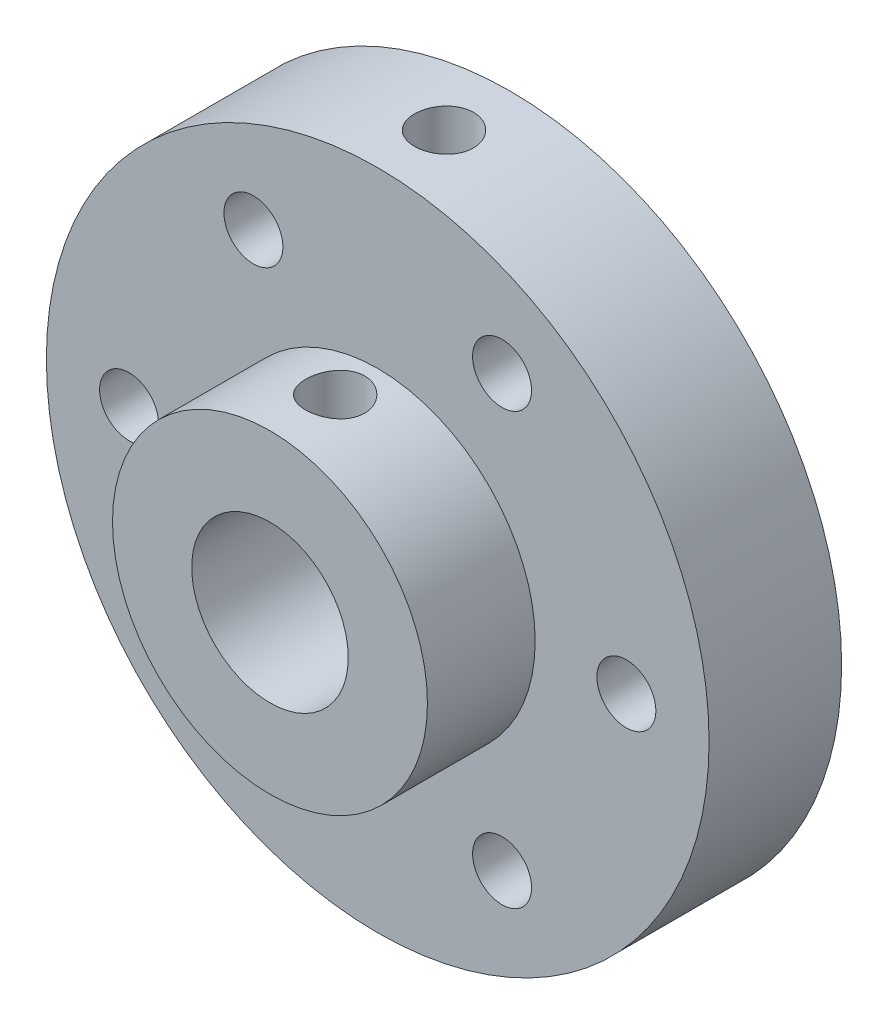
ISO-10303-21;
HEADER;
FILE_DESCRIPTION(('STEP AP214'),'2;1');
FILE_NAME('part.step','',(''),(''),'','','');
FILE_SCHEMA(('AUTOMOTIVE_DESIGN { 1 0 10303 214 1 1 1 1 }'));
ENDSEC;
DATA;
#1=APPLICATION_CONTEXT('core data for automotive mechanical design processes');
#2=APPLICATION_PROTOCOL_DEFINITION('international standard','automotive_design',2000,#1);
#3=PRODUCT_CONTEXT('',#1,'mechanical');
#4=PRODUCT('Part','Part','',(#3));
#5=PRODUCT_RELATED_PRODUCT_CATEGORY('part','',(#4));
#6=PRODUCT_DEFINITION_FORMATION('','',#4);
#7=PRODUCT_DEFINITION_CONTEXT('part definition',#1,'design');
#8=PRODUCT_DEFINITION('design','',#6,#7);
#9=PRODUCT_DEFINITION_SHAPE('','',#8);
#10=(LENGTH_UNIT() NAMED_UNIT(*) SI_UNIT(.MILLI.,.METRE.));
#11=(NAMED_UNIT(*) PLANE_ANGLE_UNIT() SI_UNIT($,.RADIAN.));
#12=(NAMED_UNIT(*) SI_UNIT($,.STERADIAN.) SOLID_ANGLE_UNIT());
#13=UNCERTAINTY_MEASURE_WITH_UNIT(LENGTH_MEASURE(1.E-05),#10,'distance_accuracy_value','');
#14=(GEOMETRIC_REPRESENTATION_CONTEXT(3) GLOBAL_UNCERTAINTY_ASSIGNED_CONTEXT((#13)) GLOBAL_UNIT_ASSIGNED_CONTEXT((#10,
#11,#12)) REPRESENTATION_CONTEXT('',''));
#15=CARTESIAN_POINT('',(0.,0.,0.));
#16=DIRECTION('',(0.,0.,1.));
#17=DIRECTION('',(1.,0.,0.));
#18=AXIS2_PLACEMENT_3D('',#15,#16,#17);
#19=CARTESIAN_POINT('',(0.,0.,0.));
#20=DIRECTION('',(0.,0.,1.));
#21=DIRECTION('',(0.,-1.,0.));
#22=AXIS2_PLACEMENT_3D('',#19,#20,#21);
#23=PLANE('',#22);
#24=CARTESIAN_POINT('',(0.,0.,0.));
#25=DIRECTION('',(0.,0.,1.));
#26=DIRECTION('',(1.,0.,0.));
#27=AXIS2_PLACEMENT_3D('',#24,#25,#26);
#28=CIRCLE('',#27,3.);
#29=CARTESIAN_POINT('',(3.,0.,0.));
#30=VERTEX_POINT('',#29);
#31=EDGE_CURVE('E123',#30,#30,#28,.T.);
#32=ORIENTED_EDGE('',*,*,#31,.F.);
#33=EDGE_LOOP('',(#32));
#34=FACE_BOUND('',#33,.T.);
#35=CARTESIAN_POINT('',(0.,0.,0.));
#36=DIRECTION('',(0.,0.,-1.));
#37=DIRECTION('',(0.,1.,0.));
#38=AXIS2_PLACEMENT_3D('',#35,#36,#37);
#39=CIRCLE('',#38,6.035);
#40=CARTESIAN_POINT('',(0.,6.035,0.));
#41=VERTEX_POINT('',#40);
#42=EDGE_CURVE('E45',#41,#41,#39,.T.);
#43=ORIENTED_EDGE('',*,*,#42,.F.);
#44=EDGE_LOOP('',(#43));
#45=FACE_BOUND('',#44,.T.);
#46=ADVANCED_FACE('F34',(#34,#45),#23,.T.);
#47=CARTESIAN_POINT('',(0.,0.,-9.21));
#48=DIRECTION('',(0.,0.,-1.));
#49=DIRECTION('',(0.,1.,0.));
#50=AXIS2_PLACEMENT_3D('',#47,#48,#49);
#51=CYLINDRICAL_SURFACE('',#50,6.035);
#52=CARTESIAN_POINT('',(0.,6.035,-1.36970000000001));
#53=CARTESIAN_POINT('',(0.0629000433476357,6.03499886134059,-1.36970240488307));
#54=CARTESIAN_POINT('',(0.125831391425128,6.03400647840521,-1.37496822702608));
#55=CARTESIAN_POINT('',(0.249920806547817,6.03014331765489,-1.3958788722969));
#56=CARTESIAN_POINT('',(0.311077329991857,6.02727095306111,-1.41153246326749));
#57=CARTESIAN_POINT('',(0.429804540368061,6.01996914808601,-1.45272260371907));
#58=CARTESIAN_POINT('',(0.487378408214051,6.01554111283683,-1.47825023673942));
#59=CARTESIAN_POINT('',(0.597420627254116,6.00561153788946,-1.53843853894474));
#60=CARTESIAN_POINT('',(0.649889393042994,6.0001100854747,-1.57309846563009));
#61=CARTESIAN_POINT('',(0.748864341538266,5.98856742084591,-1.6510071697802));
#62=CARTESIAN_POINT('',(0.795300695405039,5.98252106174991,-1.6943439041547));
#63=CARTESIAN_POINT('',(0.880288585307893,5.97060825928747,-1.78818684659765));
#64=CARTESIAN_POINT('',(0.918839555674901,5.96474182885409,-1.83869356857528));
#65=CARTESIAN_POINT('',(0.987252679124718,5.95380307124472,-1.94593612067012));
#66=CARTESIAN_POINT('',(1.01704382078181,5.94873738015613,-2.00271798747267));
#67=CARTESIAN_POINT('',(1.06663704313754,5.94004615991376,-2.12059140718623));
#68=CARTESIAN_POINT('',(1.08643998326944,5.93642050685786,-2.18168258878714));
#69=CARTESIAN_POINT('',(1.11527060982378,5.93107166473335,-2.30569340477394));
#70=CARTESIAN_POINT('',(1.12442006037612,5.9293269943887,-2.36858378597437));
#71=CARTESIAN_POINT('',(1.13206193260386,5.92787288703458,-2.495029354381));
#72=CARTESIAN_POINT('',(1.13055530780513,5.92816326792483,-2.55858448159629));
#73=CARTESIAN_POINT('',(1.117026536783,5.93072689569912,-2.68367340796085));
#74=CARTESIAN_POINT('',(1.10514283390271,5.93297403584099,-2.74522279426598));
#75=CARTESIAN_POINT('',(1.07141526090778,5.93915698039463,-2.86543850298409));
#76=CARTESIAN_POINT('',(1.04957096840743,5.94309285641801,-2.92410470301667));
#77=CARTESIAN_POINT('',(0.99640684952613,5.95223709905788,-3.03729389887621));
#78=CARTESIAN_POINT('',(0.96503110464925,5.95745293920249,-3.09179000150437));
#79=CARTESIAN_POINT('',(0.893734272476342,5.96856447124339,-3.19479603641457));
#80=CARTESIAN_POINT('',(0.853812319794279,5.97446023196029,-3.24330536169282));
#81=CARTESIAN_POINT('',(0.765809802289507,5.98638106448146,-3.33376074218772));
#82=CARTESIAN_POINT('',(0.717610818960128,5.99240671185673,-3.37559159942974));
#83=CARTESIAN_POINT('',(0.614818729982514,6.00382317499846,-3.45059126575807));
#84=CARTESIAN_POINT('',(0.560225560504309,6.00921398442658,-3.48375998836394));
#85=CARTESIAN_POINT('',(0.446074756402175,6.01876421921046,-3.54051075365898));
#86=CARTESIAN_POINT('',(0.386511037778767,6.02292210626645,-3.56408083382682));
#87=CARTESIAN_POINT('',(0.264174542109994,6.02952612127726,-3.6008488731934));
#88=CARTESIAN_POINT('',(0.201402105941537,6.03197243065701,-3.61404793172484));
#89=CARTESIAN_POINT('',(0.0754211642665352,6.03485274241377,-3.62953895449484));
#90=CARTESIAN_POINT('',(0.012232711707743,6.03531586354881,-3.63198876116582));
#91=CARTESIAN_POINT('',(-0.113650945196339,6.03425804533258,-3.62633510886476));
#92=CARTESIAN_POINT('',(-0.176346173567993,6.03273720323547,-3.61823216719006));
#93=CARTESIAN_POINT('',(-0.298963179403309,6.0279004749052,-3.5918342591006));
#94=CARTESIAN_POINT('',(-0.358902750838081,6.02459865766851,-3.57361914233358));
#95=CARTESIAN_POINT('',(-0.474877223760371,6.01656868420868,-3.52760034026577));
#96=CARTESIAN_POINT('',(-0.530911860289064,6.01184043131437,-3.49979600507443));
#97=CARTESIAN_POINT('',(-0.638159600114296,6.001409434535,-3.43503854704945));
#98=CARTESIAN_POINT('',(-0.689313454912784,5.99569662522632,-3.39798895453785));
#99=CARTESIAN_POINT('',(-0.784734482088752,5.98395623625058,-3.31592324845027));
#100=CARTESIAN_POINT('',(-0.829001012224593,5.97792862729843,-3.27090639276425));
#101=CARTESIAN_POINT('',(-0.909990440039786,5.96614141315738,-3.17346951690025));
#102=CARTESIAN_POINT('',(-0.946605631933066,5.96038641631367,-3.12095932152067));
#103=CARTESIAN_POINT('',(-1.0104958074417,5.94988872574178,-3.01044083582257));
#104=CARTESIAN_POINT('',(-1.03777113769475,5.94514599444704,-2.95243274965368));
#105=CARTESIAN_POINT('',(-1.08205456009771,5.93724597808513,-2.8328388416433));
#106=CARTESIAN_POINT('',(-1.09911206154178,5.93408107595459,-2.77127184181855));
#107=CARTESIAN_POINT('',(-1.12262802723903,5.92967764500398,-2.64608093237789));
#108=CARTESIAN_POINT('',(-1.12908768433533,5.92843889938568,-2.58245725507396));
#109=CARTESIAN_POINT('',(-1.13118475232775,5.92803901490919,-2.45603786572792));
#110=CARTESIAN_POINT('',(-1.12699205575632,5.92884526049791,-2.39324501220331));
#111=CARTESIAN_POINT('',(-1.10827533636272,5.93237220209273,-2.26927603181278));
#112=CARTESIAN_POINT('',(-1.09375137493382,5.93509288672233,-2.20809989534179));
#113=CARTESIAN_POINT('',(-1.0548560198804,5.94212843295864,-2.08919203283175));
#114=CARTESIAN_POINT('',(-1.03050298351291,5.9464403214766,-2.03145411482777));
#115=CARTESIAN_POINT('',(-0.972659344746187,5.9561745463138,-1.92085650050148));
#116=CARTESIAN_POINT('',(-0.939168098786835,5.96159696083534,-1.86799714810406));
#117=CARTESIAN_POINT('',(-0.863407927287443,5.97304253398224,-1.7678060565969));
#118=CARTESIAN_POINT('',(-0.821015345999037,5.9790734570036,-1.72056869164858));
#119=CARTESIAN_POINT('',(-0.728913736211218,5.9909983823006,-1.63382133019129));
#120=CARTESIAN_POINT('',(-0.679203029141739,5.99689235280315,-1.59431311138361));
#121=CARTESIAN_POINT('',(-0.573341513826198,6.00794135472147,-1.52381418732476));
#122=CARTESIAN_POINT('',(-0.517136881637033,6.01308927509203,-1.49290315617854));
#123=CARTESIAN_POINT('',(-0.400253762942429,6.0219967001712,-1.44101195288024));
#124=CARTESIAN_POINT('',(-0.339579543562609,6.02575750906655,-1.420022447078));
#125=CARTESIAN_POINT('',(-0.232272020100486,6.03069968135391,-1.39283489163944));
#126=CARTESIAN_POINT('',(-0.186266273939011,6.03230319854715,-1.38417412501953));
#127=CARTESIAN_POINT('',(-0.093512774026035,6.03445376777904,-1.37260585805694));
#128=CARTESIAN_POINT('',(-0.0467650390960527,6.03500084657258,-1.36969821201316));
#129=CARTESIAN_POINT('',(0.,6.035,-1.36970000000001));
#130=B_SPLINE_CURVE_WITH_KNOTS('',3,(#52,#53,#54,#55,#56,#57,#58,#59,#60,#61,#62,#63,#64,#65,
#66,#67,#68,#69,#70,#71,#72,#73,#74,#75,#76,#77,#78,#79,#80,#81,#82,#83,#84,#85,#86,#87,#88,#89,
#90,#91,#92,#93,#94,#95,#96,#97,#98,#99,#100,#101,#102,#103,#104,#105,#106,#107,#108,#109,#110,
#111,#112,#113,#114,#115,#116,#117,#118,#119,#120,#121,#122,#123,#124,#125,#126,#127,#128,#129),
.UNSPECIFIED.,.T.,.F.,(4,2,2,2,2,2,2,2,2,2,2,2,2,2,2,2,2,2,2,2,2,2,2,2,2,2,2,2,2,2,2,2,2,2,2,2,
2,2,4),(0.,0.188529108055731,0.377217547694085,0.565735994137599,0.754239117847354,
0.944759811637769,1.13529416790842,1.32733300382976,1.51935531297893,1.70916066313998,
1.89894902937279,2.08624341000137,2.273545733717,2.46196885638947,2.65041106775448,
2.84181642524419,3.03322369360092,3.22486878282533,3.41649355484724,3.60529487831158,
3.7940869470541,3.98140901985262,4.16874379053452,4.35812163577861,4.54751712989832,
4.73942170394284,4.93131915490844,5.12228101516608,5.31322138018692,5.50113565079367,
5.68904880473428,5.87661261507431,6.06418963804156,6.25456888281597,6.44499186341305,
6.63712486042647,6.82907674729644,6.96924826281525,7.10941622836406),.UNSPECIFIED.);
#131=CARTESIAN_POINT('',(0.,6.035,-1.36970000000001));
#132=VERTEX_POINT('',#131);
#133=EDGE_CURVE('E57',#132,#132,#130,.T.);
#134=ORIENTED_EDGE('',*,*,#133,.F.);
#135=EDGE_LOOP('',(#134));
#136=FACE_BOUND('',#135,.T.);
#137=ORIENTED_EDGE('',*,*,#42,.T.);
#138=EDGE_LOOP('',(#137));
#139=FACE_BOUND('',#138,.T.);
#140=CARTESIAN_POINT('',(0.,0.,-4.13));
#141=DIRECTION('',(0.,0.,-1.));
#142=DIRECTION('',(0.,1.,0.));
#143=AXIS2_PLACEMENT_3D('',#140,#141,#142);
#144=CIRCLE('',#143,6.035);
#145=CARTESIAN_POINT('',(0.,6.035,-4.13));
#146=VERTEX_POINT('',#145);
#147=EDGE_CURVE('E49',#146,#146,#144,.T.);
#148=ORIENTED_EDGE('',*,*,#147,.F.);
#149=EDGE_LOOP('',(#148));
#150=FACE_BOUND('',#149,.T.);
#151=ADVANCED_FACE('F65',(#136,#139,#150),#51,.T.);
#152=CARTESIAN_POINT('',(0.,6.035,-4.13));
#153=DIRECTION('',(0.,0.,1.));
#154=DIRECTION('',(0.,-1.,0.));
#155=AXIS2_PLACEMENT_3D('',#152,#153,#154);
#156=PLANE('',#155);
#157=CARTESIAN_POINT('',(-9.53,0.,-4.12999999999999));
#158=DIRECTION('',(0.,0.,1.));
#159=DIRECTION('',(1.,0.,0.));
#160=AXIS2_PLACEMENT_3D('',#157,#158,#159);
#161=CIRCLE('',#160,1.13029999999999);
#162=CARTESIAN_POINT('',(-8.39970000000001,0.,-4.12999999999999));
#163=VERTEX_POINT('',#162);
#164=EDGE_CURVE('E86',#163,#163,#161,.T.);
#165=ORIENTED_EDGE('',*,*,#164,.F.);
#166=EDGE_LOOP('',(#165));
#167=FACE_BOUND('',#166,.T.);
#168=CARTESIAN_POINT('',(-4.76499999999998,8.25322209806571,-4.12999999999999));
#169=DIRECTION('',(0.,0.,1.));
#170=DIRECTION('',(1.,0.,0.));
#171=AXIS2_PLACEMENT_3D('',#168,#169,#170);
#172=CIRCLE('',#171,1.13029999999999);
#173=CARTESIAN_POINT('',(-3.63469999999999,8.25322209806571,-4.12999999999999));
#174=VERTEX_POINT('',#173);
#175=EDGE_CURVE('E167',#174,#174,#172,.T.);
#176=ORIENTED_EDGE('',*,*,#175,.F.);
#177=EDGE_LOOP('',(#176));
#178=FACE_BOUND('',#177,.T.);
#179=CARTESIAN_POINT('',(4.76500000000004,8.25322209806568,-4.12999999999999));
#180=DIRECTION('',(0.,0.,1.));
#181=DIRECTION('',(1.,0.,0.));
#182=AXIS2_PLACEMENT_3D('',#179,#180,#181);
#183=CIRCLE('',#182,1.13029999999999);
#184=CARTESIAN_POINT('',(5.89530000000003,8.25322209806568,-4.12999999999999));
#185=VERTEX_POINT('',#184);
#186=EDGE_CURVE('E161',#185,#185,#183,.T.);
#187=ORIENTED_EDGE('',*,*,#186,.F.);
#188=EDGE_LOOP('',(#187));
#189=FACE_BOUND('',#188,.T.);
#190=CARTESIAN_POINT('',(9.53,0.,-4.12999999999999));
#191=DIRECTION('',(0.,0.,1.));
#192=DIRECTION('',(1.,0.,0.));
#193=AXIS2_PLACEMENT_3D('',#190,#191,#192);
#194=CIRCLE('',#193,1.13029999999999);
#195=CARTESIAN_POINT('',(10.6603,0.,-4.12999999999999));
#196=VERTEX_POINT('',#195);
#197=EDGE_CURVE('E155',#196,#196,#194,.T.);
#198=ORIENTED_EDGE('',*,*,#197,.F.);
#199=EDGE_LOOP('',(#198));
#200=FACE_BOUND('',#199,.T.);
#201=CARTESIAN_POINT('',(4.76499999999992,-8.25322209806574,-4.12999999999999));
#202=DIRECTION('',(0.,0.,1.));
#203=DIRECTION('',(1.,0.,0.));
#204=AXIS2_PLACEMENT_3D('',#201,#202,#203);
#205=CIRCLE('',#204,1.13029999999999);
#206=CARTESIAN_POINT('',(5.89529999999991,-8.25322209806574,-4.12999999999999));
#207=VERTEX_POINT('',#206);
#208=EDGE_CURVE('E149',#207,#207,#205,.T.);
#209=ORIENTED_EDGE('',*,*,#208,.F.);
#210=EDGE_LOOP('',(#209));
#211=FACE_BOUND('',#210,.T.);
#212=CARTESIAN_POINT('',(-4.7650000000001,-8.25322209806565,-4.12999999999999));
#213=DIRECTION('',(0.,0.,1.));
#214=DIRECTION('',(1.,0.,0.));
#215=AXIS2_PLACEMENT_3D('',#212,#213,#214);
#216=CIRCLE('',#215,1.13029999999999);
#217=CARTESIAN_POINT('',(-3.63470000000011,-8.25322209806565,-4.12999999999999));
#218=VERTEX_POINT('',#217);
#219=EDGE_CURVE('E132',#218,#218,#216,.T.);
#220=ORIENTED_EDGE('',*,*,#219,.F.);
#221=EDGE_LOOP('',(#220));
#222=FACE_BOUND('',#221,.T.);
#223=ORIENTED_EDGE('',*,*,#147,.T.);
#224=EDGE_LOOP('',(#223));
#225=FACE_BOUND('',#224,.T.);
#226=CARTESIAN_POINT('',(0.,0.,-4.12999999999999));
#227=DIRECTION('',(0.,0.,-1.));
#228=DIRECTION('',(0.,1.,0.));
#229=AXIS2_PLACEMENT_3D('',#226,#227,#228);
#230=CIRCLE('',#229,12.7);
#231=CARTESIAN_POINT('',(0.,12.7,-4.13));
#232=VERTEX_POINT('',#231);
#233=EDGE_CURVE('E54',#232,#232,#230,.T.);
#234=ORIENTED_EDGE('',*,*,#233,.F.);
#235=EDGE_LOOP('',(#234));
#236=FACE_BOUND('',#235,.T.);
#237=ADVANCED_FACE('F106',(#167,#178,#189,#200,#211,#222,#225,#236),#156,.T.);
#238=CARTESIAN_POINT('',(0.,0.,-9.21));
#239=DIRECTION('',(0.,0.,-1.));
#240=DIRECTION('',(0.,1.,0.));
#241=AXIS2_PLACEMENT_3D('',#238,#239,#240);
#242=CYLINDRICAL_SURFACE('',#241,12.7);
#243=CARTESIAN_POINT('',(0.,12.7,-5.53970000000001));
#244=CARTESIAN_POINT('',(0.0633549662870578,12.6999993442662,-5.53970275996524));
#245=CARTESIAN_POINT('',(0.126752665207346,12.6995208743728,-5.54504463045692));
#246=CARTESIAN_POINT('',(0.251792843437398,12.6976581682521,-5.56627511603167));
#247=CARTESIAN_POINT('',(0.313433270551566,12.6962729149133,-5.5821755746525));
#248=CARTESIAN_POINT('',(0.433129919396754,12.6927531279238,-5.62405879468068));
#249=CARTESIAN_POINT('',(0.491188190521169,12.6906190274599,-5.65003572804752));
#250=CARTESIAN_POINT('',(0.60210692242587,12.68584065064,-5.71132379024321));
#251=CARTESIAN_POINT('',(0.65496846679239,12.6831964809823,-5.74663296748805));
#252=CARTESIAN_POINT('',(0.754159197131341,12.6776859812866,-5.8256929641805));
#253=CARTESIAN_POINT('',(0.800471309893539,12.6748190997262,-5.8694651676134));
#254=CARTESIAN_POINT('',(0.885101966605945,12.6691908973995,-5.9641633345258));
#255=CARTESIAN_POINT('',(0.923420153597667,12.6664295813516,-6.01508961729169));
#256=CARTESIAN_POINT('',(0.991034006795328,12.6613193372878,-6.12275496911822));
#257=CARTESIAN_POINT('',(1.0203145082189,12.6589711052143,-6.1795035975264));
#258=CARTESIAN_POINT('',(1.06892497046169,12.6549594154603,-6.2971362454533));
#259=CARTESIAN_POINT('',(1.08825512933881,12.6532959441501,-6.35802018263293));
#260=CARTESIAN_POINT('',(1.11636627626064,12.6508468875705,-6.48202297237842));
#261=CARTESIAN_POINT('',(1.12517526603385,12.65005897243,-6.54513543024121));
#262=CARTESIAN_POINT('',(1.13208054267278,12.6494429242787,-6.67194763005314));
#263=CARTESIAN_POINT('',(1.13017705628481,12.6496147709531,-6.73564735954326));
#264=CARTESIAN_POINT('',(1.11573453505945,12.6508967086965,-6.86163364643223));
#265=CARTESIAN_POINT('',(1.10322597749987,12.6520041110958,-6.9239237288023));
#266=CARTESIAN_POINT('',(1.06797575874835,12.6550281729631,-7.04551680096643));
#267=CARTESIAN_POINT('',(1.04523398531445,12.6569448413074,-7.10481975798859));
#268=CARTESIAN_POINT('',(0.99012892098387,12.661374570342,-7.21885204091671));
#269=CARTESIAN_POINT('',(0.957752004966514,12.6638884745654,-7.27357474850884));
#270=CARTESIAN_POINT('',(0.884305528900147,12.6692286657572,-7.37682076504201));
#271=CARTESIAN_POINT('',(0.843235767712838,12.6720549599532,-7.42534393049405));
#272=CARTESIAN_POINT('',(0.753398711268008,12.6777134478915,-7.51499064342493));
#273=CARTESIAN_POINT('',(0.704605076649216,12.6805456278451,-7.55608780111357));
#274=CARTESIAN_POINT('',(0.600797098391812,12.6858874119665,-7.62951170078229));
#275=CARTESIAN_POINT('',(0.545782749786354,12.6883970158769,-7.66183843575969));
#276=CARTESIAN_POINT('',(0.431077483891177,12.692811467624,-7.71680239672926));
#277=CARTESIAN_POINT('',(0.371385977360793,12.6947162391092,-7.73943839952807));
#278=CARTESIAN_POINT('',(0.249028930160309,12.6977055702252,-7.77435959074977));
#279=CARTESIAN_POINT('',(0.186363459939342,12.6987901492749,-7.78664502423433));
#280=CARTESIAN_POINT('',(0.0600660041406316,12.7000144007699,-7.8004831265007));
#281=CARTESIAN_POINT('',(-0.00356195903673935,12.7001572813243,-7.80207223512961));
#282=CARTESIAN_POINT('',(-0.130179123062568,12.6994906162937,-7.79456811790859));
#283=CARTESIAN_POINT('',(-0.193168330713414,12.6986810808622,-7.78547500593909));
#284=CARTESIAN_POINT('',(-0.31661564173633,12.6962026618106,-7.75689477944628));
#285=CARTESIAN_POINT('',(-0.377077698751922,12.6945351793369,-7.73742461024133));
#286=CARTESIAN_POINT('',(-0.493877017716602,12.6905281036814,-7.68866029739496));
#287=CARTESIAN_POINT('',(-0.550214205605928,12.6881884984357,-7.65936597741897));
#288=CARTESIAN_POINT('',(-0.657330068574674,12.6830912656799,-7.59169373241326));
#289=CARTESIAN_POINT('',(-0.708093479326381,12.6803325372428,-7.55329173027504));
#290=CARTESIAN_POINT('',(-0.802466579915459,12.6747105175415,-7.46852891040849));
#291=CARTESIAN_POINT('',(-0.846076127884287,12.6718472242049,-7.42216793488274));
#292=CARTESIAN_POINT('',(-0.925029072785661,12.6663292375558,-7.32264477851914));
#293=CARTESIAN_POINT('',(-0.960348646577448,12.6636751596436,-7.2694636596163));
#294=CARTESIAN_POINT('',(-1.0215555683374,12.6588850522987,-7.15790382330091));
#295=CARTESIAN_POINT('',(-1.0474430217618,12.6567490170742,-7.09952516400876));
#296=CARTESIAN_POINT('',(-1.08901049476346,12.6532404409206,-6.97931090720171));
#297=CARTESIAN_POINT('',(-1.10470496682232,12.6518668193799,-6.91748033987343));
#298=CARTESIAN_POINT('',(-1.12548797292162,12.6500350747212,-6.79204883559887));
#299=CARTESIAN_POINT('',(-1.1305767425878,12.649576931264,-6.72844793801565));
#300=CARTESIAN_POINT('',(-1.13000099869347,12.6496283581755,-6.60151792687398));
#301=CARTESIAN_POINT('',(-1.12437391313382,12.6501345603107,-6.53818863882938));
#302=CARTESIAN_POINT('',(-1.10260437390431,12.6520504780416,-6.41337852391188));
#303=CARTESIAN_POINT('',(-1.08646190541541,12.6534601949106,-6.3518976996441));
#304=CARTESIAN_POINT('',(-1.04412958765888,12.6570234016182,-6.23252818113133));
#305=CARTESIAN_POINT('',(-1.01794055344363,12.6591768311197,-6.17463919593202));
#306=CARTESIAN_POINT('',(-0.956262575165949,12.6639849385614,-6.06407320902908));
#307=CARTESIAN_POINT('',(-0.920773746892059,12.6666396102607,-6.01139614244489));
#308=CARTESIAN_POINT('',(-0.841362858948853,12.6721621485101,-5.91255760546411));
#309=CARTESIAN_POINT('',(-0.797413007717868,12.6750306980047,-5.86641850195347));
#310=CARTESIAN_POINT('',(-0.702379940550797,12.6806515272886,-5.78215208116954));
#311=CARTESIAN_POINT('',(-0.651295006881942,12.6834037788713,-5.7440266987094));
#312=CARTESIAN_POINT('',(-0.543330140990368,12.6884875727796,-5.67681120811585));
#313=CARTESIAN_POINT('',(-0.486438442445037,12.6908182332511,-5.64773994919049));
#314=CARTESIAN_POINT('',(-0.368598504243942,12.6947861884187,-5.59960045235026));
#315=CARTESIAN_POINT('',(-0.307654989327822,12.6964242748526,-5.58052078624174));
#316=CARTESIAN_POINT('',(-0.205297080416445,12.6984048358795,-5.55773289050011));
#317=CARTESIAN_POINT('',(-0.164539754289082,12.6990002781437,-5.55097962458263));
#318=CARTESIAN_POINT('',(-0.0825276628943306,12.6997980731845,-5.54196228730164));
#319=CARTESIAN_POINT('',(-0.0412728991709901,12.7000004271809,-5.53969820200732));
#320=CARTESIAN_POINT('',(0.,12.7,-5.53970000000001));
#321=B_SPLINE_CURVE_WITH_KNOTS('',3,(#243,#244,#245,#246,#247,#248,#249,#250,#251,#252,#253,
#254,#255,#256,#257,#258,#259,#260,#261,#262,#263,#264,#265,#266,#267,#268,#269,#270,#271,#272,
#273,#274,#275,#276,#277,#278,#279,#280,#281,#282,#283,#284,#285,#286,#287,#288,#289,#290,#291,
#292,#293,#294,#295,#296,#297,#298,#299,#300,#301,#302,#303,#304,#305,#306,#307,#308,#309,#310,
#311,#312,#313,#314,#315,#316,#317,#318,#319,#320),.UNSPECIFIED.,.T.,.F.,(4,2,2,2,2,2,2,2,2,2,2,
2,2,2,2,2,2,2,2,2,2,2,2,2,2,2,2,2,2,2,2,2,2,2,2,2,2,2,4),(0.,0.189914200719066,
0.380041788304177,0.570059573297018,0.760037652656218,0.950502185906144,1.14097522228554,
1.33176614687074,1.52255327368612,1.71283148752738,1.90310567384788,2.09283488891786,
2.28256618506335,2.47256706685702,2.66257234544273,2.85324010665162,3.0439080200977,
3.23459999313065,3.42528745118416,3.6153249519465,3.80536042678588,3.99508652784743,
4.18481603450222,4.37505281433224,4.56529336629959,4.75607410165669,4.94685270391613,
5.13736020994908,5.32786348345201,5.51770259330726,5.70754197069814,5.89736595015787,
6.08718756629667,6.27764366067293,6.46814568561706,6.65904169388162,6.84971887938925,
6.97343978780015,7.09716031227967),.UNSPECIFIED.);
#322=CARTESIAN_POINT('',(0.,12.7,-5.53970000000001));
#323=VERTEX_POINT('',#322);
#324=EDGE_CURVE('E10',#323,#323,#321,.T.);
#325=ORIENTED_EDGE('',*,*,#324,.F.);
#326=EDGE_LOOP('',(#325));
#327=FACE_BOUND('',#326,.T.);
#328=ORIENTED_EDGE('',*,*,#233,.T.);
#329=EDGE_LOOP('',(#328));
#330=FACE_BOUND('',#329,.T.);
#331=CARTESIAN_POINT('',(0.,0.,-9.21));
#332=DIRECTION('',(0.,0.,-1.));
#333=DIRECTION('',(0.,1.,0.));
#334=AXIS2_PLACEMENT_3D('',#331,#332,#333);
#335=CIRCLE('',#334,12.7);
#336=CARTESIAN_POINT('',(0.,12.7,-9.21));
#337=VERTEX_POINT('',#336);
#338=EDGE_CURVE('E129',#337,#337,#335,.T.);
#339=ORIENTED_EDGE('',*,*,#338,.F.);
#340=EDGE_LOOP('',(#339));
#341=FACE_BOUND('',#340,.T.);
#342=ADVANCED_FACE('F102',(#327,#330,#341),#242,.T.);
#343=CARTESIAN_POINT('',(0.,12.7,-9.21000000000001));
#344=DIRECTION('',(0.,0.,-1.));
#345=DIRECTION('',(0.,1.,0.));
#346=AXIS2_PLACEMENT_3D('',#343,#344,#345);
#347=PLANE('',#346);
#348=CARTESIAN_POINT('',(-9.53,0.,-9.21));
#349=DIRECTION('',(0.,0.,1.));
#350=DIRECTION('',(1.,0.,0.));
#351=AXIS2_PLACEMENT_3D('',#348,#349,#350);
#352=CIRCLE('',#351,1.1303);
#353=CARTESIAN_POINT('',(-8.3997,0.,-9.21));
#354=VERTEX_POINT('',#353);
#355=EDGE_CURVE('E169',#354,#354,#352,.T.);
#356=ORIENTED_EDGE('',*,*,#355,.T.);
#357=EDGE_LOOP('',(#356));
#358=FACE_BOUND('',#357,.T.);
#359=CARTESIAN_POINT('',(-4.76499999999998,8.25322209806571,-9.21));
#360=DIRECTION('',(0.,0.,1.));
#361=DIRECTION('',(1.,0.,0.));
#362=AXIS2_PLACEMENT_3D('',#359,#360,#361);
#363=CIRCLE('',#362,1.1303);
#364=CARTESIAN_POINT('',(-3.63469999999998,8.25322209806571,-9.21));
#365=VERTEX_POINT('',#364);
#366=EDGE_CURVE('E164',#365,#365,#363,.T.);
#367=ORIENTED_EDGE('',*,*,#366,.T.);
#368=EDGE_LOOP('',(#367));
#369=FACE_BOUND('',#368,.T.);
#370=CARTESIAN_POINT('',(4.76500000000004,8.25322209806568,-9.21));
#371=DIRECTION('',(0.,0.,1.));
#372=DIRECTION('',(1.,0.,0.));
#373=AXIS2_PLACEMENT_3D('',#370,#371,#372);
#374=CIRCLE('',#373,1.1303);
#375=CARTESIAN_POINT('',(5.89530000000004,8.25322209806568,-9.21));
#376=VERTEX_POINT('',#375);
#377=EDGE_CURVE('E158',#376,#376,#374,.T.);
#378=ORIENTED_EDGE('',*,*,#377,.T.);
#379=EDGE_LOOP('',(#378));
#380=FACE_BOUND('',#379,.T.);
#381=CARTESIAN_POINT('',(9.53,0.,-9.21));
#382=DIRECTION('',(0.,0.,1.));
#383=DIRECTION('',(1.,0.,0.));
#384=AXIS2_PLACEMENT_3D('',#381,#382,#383);
#385=CIRCLE('',#384,1.1303);
#386=CARTESIAN_POINT('',(10.6603,0.,-9.21));
#387=VERTEX_POINT('',#386);
#388=EDGE_CURVE('E152',#387,#387,#385,.T.);
#389=ORIENTED_EDGE('',*,*,#388,.T.);
#390=EDGE_LOOP('',(#389));
#391=FACE_BOUND('',#390,.T.);
#392=CARTESIAN_POINT('',(4.76499999999992,-8.25322209806574,-9.21));
#393=DIRECTION('',(0.,0.,1.));
#394=DIRECTION('',(1.,0.,0.));
#395=AXIS2_PLACEMENT_3D('',#392,#393,#394);
#396=CIRCLE('',#395,1.1303);
#397=CARTESIAN_POINT('',(5.89529999999992,-8.25322209806574,-9.21));
#398=VERTEX_POINT('',#397);
#399=EDGE_CURVE('E146',#398,#398,#396,.T.);
#400=ORIENTED_EDGE('',*,*,#399,.T.);
#401=EDGE_LOOP('',(#400));
#402=FACE_BOUND('',#401,.T.);
#403=CARTESIAN_POINT('',(-4.7650000000001,-8.25322209806565,-9.21));
#404=DIRECTION('',(0.,0.,1.));
#405=DIRECTION('',(1.,0.,0.));
#406=AXIS2_PLACEMENT_3D('',#403,#404,#405);
#407=CIRCLE('',#406,1.1303);
#408=CARTESIAN_POINT('',(-3.6347000000001,-8.25322209806565,-9.21));
#409=VERTEX_POINT('',#408);
#410=EDGE_CURVE('E126',#409,#409,#407,.T.);
#411=ORIENTED_EDGE('',*,*,#410,.T.);
#412=EDGE_LOOP('',(#411));
#413=FACE_BOUND('',#412,.T.);
#414=CARTESIAN_POINT('',(0.,0.,-9.21));
#415=DIRECTION('',(0.,0.,1.));
#416=DIRECTION('',(1.,0.,0.));
#417=AXIS2_PLACEMENT_3D('',#414,#415,#416);
#418=CIRCLE('',#417,3.);
#419=CARTESIAN_POINT('',(3.,0.,-9.21));
#420=VERTEX_POINT('',#419);
#421=EDGE_CURVE('E125',#420,#420,#418,.T.);
#422=ORIENTED_EDGE('',*,*,#421,.T.);
#423=EDGE_LOOP('',(#422));
#424=FACE_BOUND('',#423,.T.);
#425=ORIENTED_EDGE('',*,*,#338,.T.);
#426=EDGE_LOOP('',(#425));
#427=FACE_BOUND('',#426,.T.);
#428=ADVANCED_FACE('F97',(#358,#369,#380,#391,#402,#413,#424,#427),#347,.T.);
#429=CARTESIAN_POINT('',(0.,0.,-9.21));
#430=DIRECTION('',(0.,0.,1.));
#431=DIRECTION('',(1.,0.,0.));
#432=AXIS2_PLACEMENT_3D('',#429,#430,#431);
#433=CYLINDRICAL_SURFACE('',#432,3.);
#434=CARTESIAN_POINT('',(0.,3.,-5.53970000000001));
#435=CARTESIAN_POINT('',(0.0611928411443491,3.00000171846515,-5.53969771417657));
#436=CARTESIAN_POINT('',(0.122370104201509,2.99811147393054,-5.54468483805203));
#437=CARTESIAN_POINT('',(0.242895199056459,2.99075997725676,-5.56441991145483));
#438=CARTESIAN_POINT('',(0.302243311869404,2.98529927654476,-5.57916635374114));
#439=CARTESIAN_POINT('',(0.417354427930663,2.97139268185387,-5.61782374022035));
#440=CARTESIAN_POINT('',(0.47312414310064,2.96295258193503,-5.64171690427738));
#441=CARTESIAN_POINT('',(0.579859379491467,2.94392694144718,-5.69789861707658));
#442=CARTESIAN_POINT('',(0.630823594287821,2.93334081990993,-5.73018943989323));
#443=CARTESIAN_POINT('',(0.728683146385697,2.91060863113245,-5.80369340877451));
#444=CARTESIAN_POINT('',(0.775345553973624,2.89841812878863,-5.84520279338506));
#445=CARTESIAN_POINT('',(0.861234815259452,2.87406874410234,-5.93533670501375));
#446=CARTESIAN_POINT('',(0.900459361707663,2.86190987272175,-5.98396343159409));
#447=CARTESIAN_POINT('',(0.971847728545222,2.83848208116478,-6.08923581489373));
#448=CARTESIAN_POINT('',(1.0036813033119,2.82726549498316,-6.14611823666485));
#449=CARTESIAN_POINT('',(1.05722621260478,2.80768439036982,-6.2649185916901));
#450=CARTESIAN_POINT('',(1.07894163361982,2.79931872088595,-6.32683448015614));
#451=CARTESIAN_POINT('',(1.11071227287925,2.78686208746815,-6.45126202343555));
#452=CARTESIAN_POINT('',(1.12121231773436,2.78260873846398,-6.51364329009251));
#453=CARTESIAN_POINT('',(1.13164489523888,2.7783834729364,-6.6394162354247));
#454=CARTESIAN_POINT('',(1.13158184524543,2.77840976671857,-6.70280748064978));
#455=CARTESIAN_POINT('',(1.12122995636935,2.78260090856938,-6.82471709658729));
#456=CARTESIAN_POINT('',(1.11156004453705,2.78651526327398,-6.88329823854847));
#457=CARTESIAN_POINT('',(1.0832927210565,2.79762489847035,-6.99793525798757));
#458=CARTESIAN_POINT('',(1.06469395196105,2.80482067782621,-7.05399075007504));
#459=CARTESIAN_POINT('',(1.01875974221826,2.82183203740702,-7.16324032978955));
#460=CARTESIAN_POINT('',(0.991264771424987,2.83169486850285,-7.21635966075918));
#461=CARTESIAN_POINT('',(0.928429901601708,2.85291350507009,-7.31740946438343));
#462=CARTESIAN_POINT('',(0.893087276062988,2.86426982886483,-7.36533812501365));
#463=CARTESIAN_POINT('',(0.812735285251823,2.88813631917411,-7.45806938040545));
#464=CARTESIAN_POINT('',(0.76723252547283,2.90067247694304,-7.50243881008897));
#465=CARTESIAN_POINT('',(0.669288657302438,2.92482380153898,-7.58304658129858));
#466=CARTESIAN_POINT('',(0.616846464353869,2.93643882394789,-7.61928364943432));
#467=CARTESIAN_POINT('',(0.505398976296979,2.95767398522667,-7.68308187770044));
#468=CARTESIAN_POINT('',(0.446303363884755,2.96725984391052,-7.71049748839553));
#469=CARTESIAN_POINT('',(0.32388761147713,2.98310198289472,-7.75485382976176));
#470=CARTESIAN_POINT('',(0.260569380416556,2.98935975640489,-7.77179925863566));
#471=CARTESIAN_POINT('',(0.135150328252683,2.99757749960739,-7.79389848795734));
#472=CARTESIAN_POINT('',(0.073166093697947,2.99974980699883,-7.79963550894338));
#473=CARTESIAN_POINT('',(-0.0509103772352712,3.0002089165602,-7.80085493429958));
#474=CARTESIAN_POINT('',(-0.113002586279495,2.99849658988202,-7.79633963781162));
#475=CARTESIAN_POINT('',(-0.233003651167866,2.99151884709839,-7.77762491480687));
#476=CARTESIAN_POINT('',(-0.290981304533441,2.98639410224353,-7.76380866591918));
#477=CARTESIAN_POINT('',(-0.403753907940403,2.97324875497533,-7.72738991741725));
#478=CARTESIAN_POINT('',(-0.458548443107989,2.9652277760581,-7.7047862754324));
#479=CARTESIAN_POINT('',(-0.565210459586957,2.94678713567486,-7.65071196025975));
#480=CARTESIAN_POINT('',(-0.616943996823553,2.936303721142,-7.61899948928289));
#481=CARTESIAN_POINT('',(-0.714529301622564,2.9140961676402,-7.54788069768727));
#482=CARTESIAN_POINT('',(-0.760378872836557,2.90237156832864,-7.50847151782779));
#483=CARTESIAN_POINT('',(-0.847704483082616,2.8781193062046,-7.42036221258403));
#484=CARTESIAN_POINT('',(-0.888767033445837,2.86558483127444,-7.37125308525347));
#485=CARTESIAN_POINT('',(-0.962151409330943,2.84178767446505,-7.26659639683307));
#486=CARTESIAN_POINT('',(-0.994472409766734,2.83052511269589,-7.2110482286898));
#487=CARTESIAN_POINT('',(-1.04949964581568,2.81058987422826,-7.09460732978498));
#488=CARTESIAN_POINT('',(-1.07216204707732,2.80192905655408,-7.0336917156969));
#489=CARTESIAN_POINT('',(-1.10675702566343,2.78844764505051,-6.90849101537234));
#490=CARTESIAN_POINT('',(-1.118696326937,2.78362464492382,-6.8442080674359));
#491=CARTESIAN_POINT('',(-1.13090235870494,2.77868657629828,-6.71858266885129));
#492=CARTESIAN_POINT('',(-1.13187504295414,2.77828680484727,-6.65731944353219));
#493=CARTESIAN_POINT('',(-1.12393197446695,2.78150947741111,-6.53555115646685));
#494=CARTESIAN_POINT('',(-1.11501717788249,2.78513153250213,-6.47504602198289));
#495=CARTESIAN_POINT('',(-1.08810379059507,2.79575177743842,-6.35842289240913));
#496=CARTESIAN_POINT('',(-1.07039634609333,2.8026414595823,-6.30222697730856));
#497=CARTESIAN_POINT('',(-1.02665783694779,2.81895651194599,-6.19357155711729));
#498=CARTESIAN_POINT('',(-1.00062465876066,2.82838252593414,-6.14111300492044));
#499=CARTESIAN_POINT('',(-0.939379742691679,2.84932699073722,-6.03841090769974));
#500=CARTESIAN_POINT('',(-0.903756110803419,2.860929617102,-5.9884303710602));
#501=CARTESIAN_POINT('',(-0.824976639766414,2.8846324159886,-5.89493122542972));
#502=CARTESIAN_POINT('',(-0.78181839522156,2.89673274645469,-5.85141468828199));
#503=CARTESIAN_POINT('',(-0.686366712695304,2.92086459755385,-5.76964499048327));
#504=CARTESIAN_POINT('',(-0.633702126534699,2.93285596352179,-5.73181127633755));
#505=CARTESIAN_POINT('',(-0.522340920402473,2.95472116744885,-5.66554186085306));
#506=CARTESIAN_POINT('',(-0.463643734260856,2.96459480638669,-5.63710704267482));
#507=CARTESIAN_POINT('',(-0.338916425945734,2.98148834725325,-5.58954994854684));
#508=CARTESIAN_POINT('',(-0.272670783259925,2.9883511873005,-5.57093174086111));
#509=CARTESIAN_POINT('',(-0.137609304374554,2.99760489853262,-5.5460112163476));
#510=CARTESIAN_POINT('',(-0.0687948076746371,2.99999806805049,-5.53970256979053));
#511=CARTESIAN_POINT('',(0.,3.,-5.53970000000001));
#512=B_SPLINE_CURVE_WITH_KNOTS('',3,(#434,#435,#436,#437,#438,#439,#440,#441,#442,#443,#444,
#445,#446,#447,#448,#449,#450,#451,#452,#453,#454,#455,#456,#457,#458,#459,#460,#461,#462,#463,
#464,#465,#466,#467,#468,#469,#470,#471,#472,#473,#474,#475,#476,#477,#478,#479,#480,#481,#482,
#483,#484,#485,#486,#487,#488,#489,#490,#491,#492,#493,#494,#495,#496,#497,#498,#499,#500,#501,
#502,#503,#504,#505,#506,#507,#508,#509,#510,#511),.UNSPECIFIED.,.T.,.F.,(4,2,2,2,2,2,2,2,2,2,2,
2,2,2,2,2,2,2,2,2,2,2,2,2,2,2,2,2,2,2,2,2,2,2,2,2,2,2,4),(0.,0.183324752661909,
0.366621199030724,0.549563133529939,0.73255466013301,0.922608205427972,1.11272060987482,
1.31015737819276,1.50751433708923,1.69671445211231,1.88583544615766,2.06351395394755,
2.24121948262041,2.42230689494168,2.60345732113402,2.79690662838166,2.99038620541907,
3.18691140715255,3.38334835950479,3.56925879619647,3.75512754550846,3.93377280938971,
4.11244130511862,4.29637794091192,4.4803830375158,4.67516618994714,4.86996772090744,
5.06564415584765,5.26119780550664,5.44408528035502,5.62695507092464,5.80413727473147,
5.98136449317945,6.16794496469146,6.35458511058965,6.55145930383003,6.74835199095773,
6.9545571785934,7.16065630498673),.UNSPECIFIED.);
#513=CARTESIAN_POINT('',(0.,3.,-5.53970000000001));
#514=VERTEX_POINT('',#513);
#515=EDGE_CURVE('E64',#514,#514,#512,.T.);
#516=ORIENTED_EDGE('',*,*,#515,.T.);
#517=EDGE_LOOP('',(#516));
#518=FACE_BOUND('',#517,.T.);
#519=CARTESIAN_POINT('',(0.,3.,-1.36970000000001));
#520=CARTESIAN_POINT('',(0.0611928411443499,3.00000171846515,-1.36969771417658));
#521=CARTESIAN_POINT('',(0.12237010420151,2.99811147393054,-1.37468483805203));
#522=CARTESIAN_POINT('',(0.24289519905646,2.99075997725676,-1.39441991145483));
#523=CARTESIAN_POINT('',(0.302243311869404,2.98529927654476,-1.40916635374115));
#524=CARTESIAN_POINT('',(0.417354427930664,2.97139268185387,-1.44782374022035));
#525=CARTESIAN_POINT('',(0.473124143100641,2.96295258193503,-1.47171690427738));
#526=CARTESIAN_POINT('',(0.579859379491468,2.94392694144718,-1.52789861707658));
#527=CARTESIAN_POINT('',(0.630823594287822,2.93334081990993,-1.56018943989323));
#528=CARTESIAN_POINT('',(0.728683146385698,2.91060863113245,-1.63369340877451));
#529=CARTESIAN_POINT('',(0.775345553973624,2.89841812878863,-1.67520279338506));
#530=CARTESIAN_POINT('',(0.861234815259453,2.87406874410234,-1.76533670501376));
#531=CARTESIAN_POINT('',(0.900459361707664,2.86190987272175,-1.81396343159409));
#532=CARTESIAN_POINT('',(0.971847728545222,2.83848208116478,-1.91923581489373));
#533=CARTESIAN_POINT('',(1.0036813033119,2.82726549498316,-1.97611823666485));
#534=CARTESIAN_POINT('',(1.05722621260478,2.80768439036982,-2.0949185916901));
#535=CARTESIAN_POINT('',(1.07894163361982,2.79931872088594,-2.15683448015614));
#536=CARTESIAN_POINT('',(1.11071227287925,2.78686208746815,-2.28126202343555));
#537=CARTESIAN_POINT('',(1.12121231773436,2.78260873846398,-2.34364329009251));
#538=CARTESIAN_POINT('',(1.13164489523888,2.7783834729364,-2.4694162354247));
#539=CARTESIAN_POINT('',(1.13158184524543,2.77840976671857,-2.53280748064978));
#540=CARTESIAN_POINT('',(1.12122995636935,2.78260090856938,-2.65471709658729));
#541=CARTESIAN_POINT('',(1.11156004453706,2.78651526327398,-2.71329823854847));
#542=CARTESIAN_POINT('',(1.0832927210565,2.79762489847035,-2.82793525798757));
#543=CARTESIAN_POINT('',(1.06469395196105,2.80482067782621,-2.88399075007504));
#544=CARTESIAN_POINT('',(1.01875974221826,2.82183203740702,-2.99324032978955));
#545=CARTESIAN_POINT('',(0.991264771424989,2.83169486850285,-3.04635966075918));
#546=CARTESIAN_POINT('',(0.92842990160171,2.85291350507009,-3.14740946438343));
#547=CARTESIAN_POINT('',(0.893087276062989,2.86426982886483,-3.19533812501365));
#548=CARTESIAN_POINT('',(0.812735285251824,2.88813631917411,-3.28806938040545));
#549=CARTESIAN_POINT('',(0.767232525472831,2.90067247694304,-3.33243881008897));
#550=CARTESIAN_POINT('',(0.669288657302439,2.92482380153898,-3.41304658129858));
#551=CARTESIAN_POINT('',(0.616846464353871,2.93643882394789,-3.44928364943432));
#552=CARTESIAN_POINT('',(0.50539897629698,2.95767398522667,-3.51308187770044));
#553=CARTESIAN_POINT('',(0.446303363884756,2.96725984391052,-3.54049748839554));
#554=CARTESIAN_POINT('',(0.323887611477131,2.98310198289472,-3.58485382976176));
#555=CARTESIAN_POINT('',(0.260569380416556,2.98935975640489,-3.60179925863566));
#556=CARTESIAN_POINT('',(0.135150328252683,2.99757749960739,-3.62389848795734));
#557=CARTESIAN_POINT('',(0.0731660936979474,2.99974980699883,-3.62963550894338));
#558=CARTESIAN_POINT('',(-0.0509103772352705,3.0002089165602,-3.63085493429959));
#559=CARTESIAN_POINT('',(-0.113002586279494,2.99849658988202,-3.62633963781162));
#560=CARTESIAN_POINT('',(-0.233003651167865,2.99151884709839,-3.60762491480687));
#561=CARTESIAN_POINT('',(-0.29098130453344,2.98639410224353,-3.59380866591919));
#562=CARTESIAN_POINT('',(-0.403753907940402,2.97324875497533,-3.55738991741725));
#563=CARTESIAN_POINT('',(-0.458548443107988,2.9652277760581,-3.5347862754324));
#564=CARTESIAN_POINT('',(-0.565210459586957,2.94678713567486,-3.48071196025976));
#565=CARTESIAN_POINT('',(-0.616943996823553,2.936303721142,-3.44899948928289));
#566=CARTESIAN_POINT('',(-0.714529301622564,2.9140961676402,-3.37788069768727));
#567=CARTESIAN_POINT('',(-0.760378872836557,2.90237156832864,-3.33847151782779));
#568=CARTESIAN_POINT('',(-0.847704483082615,2.8781193062046,-3.25036221258403));
#569=CARTESIAN_POINT('',(-0.888767033445836,2.86558483127444,-3.20125308525347));
#570=CARTESIAN_POINT('',(-0.962151409330942,2.84178767446505,-3.09659639683307));
#571=CARTESIAN_POINT('',(-0.994472409766733,2.83052511269589,-3.0410482286898));
#572=CARTESIAN_POINT('',(-1.04949964581568,2.81058987422826,-2.92460732978498));
#573=CARTESIAN_POINT('',(-1.07216204707732,2.80192905655408,-2.86369171569691));
#574=CARTESIAN_POINT('',(-1.10675702566343,2.78844764505051,-2.73849101537234));
#575=CARTESIAN_POINT('',(-1.118696326937,2.78362464492382,-2.6742080674359));
#576=CARTESIAN_POINT('',(-1.13090235870494,2.77868657629828,-2.54858266885129));
#577=CARTESIAN_POINT('',(-1.13187504295414,2.77828680484728,-2.48731944353219));
#578=CARTESIAN_POINT('',(-1.12393197446695,2.78150947741111,-2.36555115646685));
#579=CARTESIAN_POINT('',(-1.11501717788249,2.78513153250213,-2.30504602198289));
#580=CARTESIAN_POINT('',(-1.08810379059507,2.79575177743842,-2.18842289240914));
#581=CARTESIAN_POINT('',(-1.07039634609333,2.8026414595823,-2.13222697730856));
#582=CARTESIAN_POINT('',(-1.02665783694779,2.81895651194599,-2.02357155711729));
#583=CARTESIAN_POINT('',(-1.00062465876065,2.82838252593414,-1.97111300492044));
#584=CARTESIAN_POINT('',(-0.939379742691679,2.84932699073722,-1.86841090769974));
#585=CARTESIAN_POINT('',(-0.903756110803418,2.860929617102,-1.8184303710602));
#586=CARTESIAN_POINT('',(-0.824976639766414,2.8846324159886,-1.72493122542972));
#587=CARTESIAN_POINT('',(-0.78181839522156,2.89673274645469,-1.68141468828199));
#588=CARTESIAN_POINT('',(-0.686366712695303,2.92086459755385,-1.59964499048327));
#589=CARTESIAN_POINT('',(-0.633702126534699,2.93285596352179,-1.56181127633756));
#590=CARTESIAN_POINT('',(-0.522340920402473,2.95472116744885,-1.49554186085306));
#591=CARTESIAN_POINT('',(-0.463643734260856,2.96459480638669,-1.46710704267482));
#592=CARTESIAN_POINT('',(-0.338916425945734,2.98148834725325,-1.41954994854684));
#593=CARTESIAN_POINT('',(-0.272670783259925,2.9883511873005,-1.40093174086111));
#594=CARTESIAN_POINT('',(-0.137609304374553,2.99760489853262,-1.37601121634761));
#595=CARTESIAN_POINT('',(-0.0687948076746367,2.99999806805049,-1.36970256979054));
#596=CARTESIAN_POINT('',(0.,3.,-1.36970000000001));
#597=B_SPLINE_CURVE_WITH_KNOTS('',3,(#519,#520,#521,#522,#523,#524,#525,#526,#527,#528,#529,
#530,#531,#532,#533,#534,#535,#536,#537,#538,#539,#540,#541,#542,#543,#544,#545,#546,#547,#548,
#549,#550,#551,#552,#553,#554,#555,#556,#557,#558,#559,#560,#561,#562,#563,#564,#565,#566,#567,
#568,#569,#570,#571,#572,#573,#574,#575,#576,#577,#578,#579,#580,#581,#582,#583,#584,#585,#586,
#587,#588,#589,#590,#591,#592,#593,#594,#595,#596),.UNSPECIFIED.,.T.,.F.,(4,2,2,2,2,2,2,2,2,2,2,
2,2,2,2,2,2,2,2,2,2,2,2,2,2,2,2,2,2,2,2,2,2,2,2,2,2,2,4),(0.,0.183324752661909,
0.366621199030724,0.549563133529939,0.73255466013301,0.922608205427972,1.11272060987482,
1.31015737819276,1.50751433708923,1.6967144521123,1.88583544615766,2.06351395394755,
2.2412194826204,2.42230689494168,2.60345732113402,2.79690662838166,2.99038620541907,
3.18691140715255,3.38334835950479,3.56925879619647,3.75512754550846,3.93377280938971,
4.11244130511862,4.29637794091192,4.4803830375158,4.67516618994714,4.86996772090744,
5.06564415584765,5.26119780550664,5.44408528035502,5.62695507092464,5.80413727473147,
5.98136449317944,6.16794496469146,6.35458511058965,6.55145930383003,6.74835199095773,
6.9545571785934,7.16065630498673),.UNSPECIFIED.);
#598=CARTESIAN_POINT('',(0.,3.,-1.36970000000001));
#599=VERTEX_POINT('',#598);
#600=EDGE_CURVE('E63',#599,#599,#597,.T.);
#601=ORIENTED_EDGE('',*,*,#600,.T.);
#602=EDGE_LOOP('',(#601));
#603=FACE_BOUND('',#602,.T.);
#604=ORIENTED_EDGE('',*,*,#421,.F.);
#605=EDGE_LOOP('',(#604));
#606=FACE_BOUND('',#605,.T.);
#607=ORIENTED_EDGE('',*,*,#31,.T.);
#608=EDGE_LOOP('',(#607));
#609=FACE_BOUND('',#608,.T.);
#610=ADVANCED_FACE('F91',(#518,#603,#606,#609),#433,.F.);
#611=CARTESIAN_POINT('',(-4.7650000000001,-8.25322209806565,-4.13));
#612=DIRECTION('',(0.,0.,1.));
#613=DIRECTION('',(1.,0.,0.));
#614=AXIS2_PLACEMENT_3D('',#611,#612,#613);
#615=CYLINDRICAL_SURFACE('',#614,1.13029999999999);
#616=ORIENTED_EDGE('',*,*,#410,.F.);
#617=EDGE_LOOP('',(#616));
#618=FACE_BOUND('',#617,.T.);
#619=ORIENTED_EDGE('',*,*,#219,.T.);
#620=EDGE_LOOP('',(#619));
#621=FACE_BOUND('',#620,.T.);
#622=ADVANCED_FACE('F96',(#618,#621),#615,.F.);
#623=CARTESIAN_POINT('',(4.76499999999992,-8.25322209806574,-4.13));
#624=DIRECTION('',(0.,0.,1.));
#625=DIRECTION('',(1.,0.,0.));
#626=AXIS2_PLACEMENT_3D('',#623,#624,#625);
#627=CYLINDRICAL_SURFACE('',#626,1.13029999999999);
#628=ORIENTED_EDGE('',*,*,#399,.F.);
#629=EDGE_LOOP('',(#628));
#630=FACE_BOUND('',#629,.T.);
#631=ORIENTED_EDGE('',*,*,#208,.T.);
#632=EDGE_LOOP('',(#631));
#633=FACE_BOUND('',#632,.T.);
#634=ADVANCED_FACE('F192',(#630,#633),#627,.F.);
#635=CARTESIAN_POINT('',(9.53,0.,-4.13));
#636=DIRECTION('',(0.,0.,1.));
#637=DIRECTION('',(1.,0.,0.));
#638=AXIS2_PLACEMENT_3D('',#635,#636,#637);
#639=CYLINDRICAL_SURFACE('',#638,1.13029999999999);
#640=ORIENTED_EDGE('',*,*,#388,.F.);
#641=EDGE_LOOP('',(#640));
#642=FACE_BOUND('',#641,.T.);
#643=ORIENTED_EDGE('',*,*,#197,.T.);
#644=EDGE_LOOP('',(#643));
#645=FACE_BOUND('',#644,.T.);
#646=ADVANCED_FACE('F185',(#642,#645),#639,.F.);
#647=CARTESIAN_POINT('',(4.76500000000004,8.25322209806568,-4.13));
#648=DIRECTION('',(0.,0.,1.));
#649=DIRECTION('',(1.,0.,0.));
#650=AXIS2_PLACEMENT_3D('',#647,#648,#649);
#651=CYLINDRICAL_SURFACE('',#650,1.13029999999999);
#652=ORIENTED_EDGE('',*,*,#377,.F.);
#653=EDGE_LOOP('',(#652));
#654=FACE_BOUND('',#653,.T.);
#655=ORIENTED_EDGE('',*,*,#186,.T.);
#656=EDGE_LOOP('',(#655));
#657=FACE_BOUND('',#656,.T.);
#658=ADVANCED_FACE('F180',(#654,#657),#651,.F.);
#659=CARTESIAN_POINT('',(-4.76499999999998,8.25322209806571,-4.13));
#660=DIRECTION('',(0.,0.,1.));
#661=DIRECTION('',(1.,0.,0.));
#662=AXIS2_PLACEMENT_3D('',#659,#660,#661);
#663=CYLINDRICAL_SURFACE('',#662,1.13029999999999);
#664=ORIENTED_EDGE('',*,*,#366,.F.);
#665=EDGE_LOOP('',(#664));
#666=FACE_BOUND('',#665,.T.);
#667=ORIENTED_EDGE('',*,*,#175,.T.);
#668=EDGE_LOOP('',(#667));
#669=FACE_BOUND('',#668,.T.);
#670=ADVANCED_FACE('F175',(#666,#669),#663,.F.);
#671=CARTESIAN_POINT('',(-9.53,0.,-4.13));
#672=DIRECTION('',(0.,0.,1.));
#673=DIRECTION('',(1.,0.,0.));
#674=AXIS2_PLACEMENT_3D('',#671,#672,#673);
#675=CYLINDRICAL_SURFACE('',#674,1.13029999999999);
#676=ORIENTED_EDGE('',*,*,#355,.F.);
#677=EDGE_LOOP('',(#676));
#678=FACE_BOUND('',#677,.T.);
#679=ORIENTED_EDGE('',*,*,#164,.T.);
#680=EDGE_LOOP('',(#679));
#681=FACE_BOUND('',#680,.T.);
#682=ADVANCED_FACE('F73',(#678,#681),#675,.F.);
#683=CARTESIAN_POINT('',(0.,12.7,-2.50000000000001));
#684=DIRECTION('',(0.,1.,0.));
#685=DIRECTION('',(0.,0.,1.));
#686=AXIS2_PLACEMENT_3D('',#683,#684,#685);
#687=CYLINDRICAL_SURFACE('',#686,1.13029999999999);
#688=ORIENTED_EDGE('',*,*,#133,.T.);
#689=EDGE_LOOP('',(#688));
#690=FACE_BOUND('',#689,.T.);
#691=ORIENTED_EDGE('',*,*,#600,.F.);
#692=EDGE_LOOP('',(#691));
#693=FACE_BOUND('',#692,.T.);
#694=ADVANCED_FACE('F68',(#690,#693),#687,.F.);
#695=CARTESIAN_POINT('',(0.,12.7,-6.67000000000001));
#696=DIRECTION('',(0.,1.,0.));
#697=DIRECTION('',(0.,0.,1.));
#698=AXIS2_PLACEMENT_3D('',#695,#696,#697);
#699=CYLINDRICAL_SURFACE('',#698,1.13029999999999);
#700=ORIENTED_EDGE('',*,*,#324,.T.);
#701=EDGE_LOOP('',(#700));
#702=FACE_BOUND('',#701,.T.);
#703=ORIENTED_EDGE('',*,*,#515,.F.);
#704=EDGE_LOOP('',(#703));
#705=FACE_BOUND('',#704,.T.);
#706=ADVANCED_FACE('F72',(#702,#705),#699,.F.);
#707=CLOSED_SHELL('',(#46,#151,#237,#342,#428,#610,#622,#634,#646,#658,#670,#682,#694,#706));
#708=MANIFOLD_SOLID_BREP('B2',#707);
#709=ADVANCED_BREP_SHAPE_REPRESENTATION('',(#18,#708),#14);
#710=SHAPE_DEFINITION_REPRESENTATION(#9,#709);
ENDSEC;
END-ISO-10303-21;
